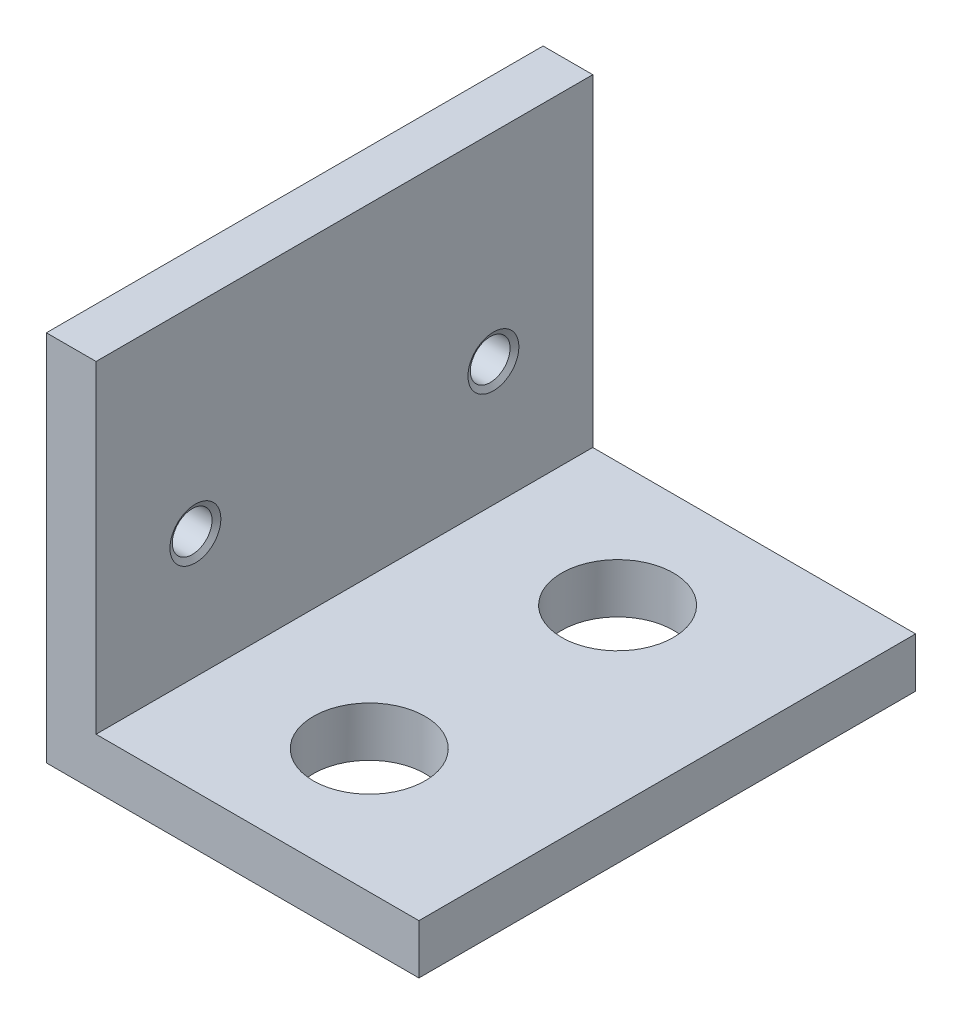
ISO-10303-21;
HEADER;
FILE_DESCRIPTION(('STEP AP214'),'2;1');
FILE_NAME('part.step','',(''),(''),'','','');
FILE_SCHEMA(('AUTOMOTIVE_DESIGN { 1 0 10303 214 1 1 1 1 }'));
ENDSEC;
DATA;
#1=APPLICATION_CONTEXT('core data for automotive mechanical design processes');
#2=APPLICATION_PROTOCOL_DEFINITION('international standard','automotive_design',2000,#1);
#3=PRODUCT_CONTEXT('',#1,'mechanical');
#4=PRODUCT('Part','Part','',(#3));
#5=PRODUCT_RELATED_PRODUCT_CATEGORY('part','',(#4));
#6=PRODUCT_DEFINITION_FORMATION('','',#4);
#7=PRODUCT_DEFINITION_CONTEXT('part definition',#1,'design');
#8=PRODUCT_DEFINITION('design','',#6,#7);
#9=PRODUCT_DEFINITION_SHAPE('','',#8);
#10=(LENGTH_UNIT() NAMED_UNIT(*) SI_UNIT(.MILLI.,.METRE.));
#11=(NAMED_UNIT(*) PLANE_ANGLE_UNIT() SI_UNIT($,.RADIAN.));
#12=(NAMED_UNIT(*) SI_UNIT($,.STERADIAN.) SOLID_ANGLE_UNIT());
#13=UNCERTAINTY_MEASURE_WITH_UNIT(LENGTH_MEASURE(1.E-05),#10,'distance_accuracy_value','');
#14=(GEOMETRIC_REPRESENTATION_CONTEXT(3) GLOBAL_UNCERTAINTY_ASSIGNED_CONTEXT((#13)) GLOBAL_UNIT_ASSIGNED_CONTEXT((#10,
#11,#12)) REPRESENTATION_CONTEXT('',''));
#15=CARTESIAN_POINT('',(0.,0.,0.));
#16=DIRECTION('',(0.,0.,1.));
#17=DIRECTION('',(1.,0.,0.));
#18=AXIS2_PLACEMENT_3D('',#15,#16,#17);
#19=CARTESIAN_POINT('',(15.,0.,20.));
#20=DIRECTION('',(0.,1.,0.));
#21=DIRECTION('',(-1.,0.,0.));
#22=AXIS2_PLACEMENT_3D('',#19,#20,#21);
#23=PLANE('',#22);
#24=CARTESIAN_POINT('',(8.,0.,5.));
#25=DIRECTION('',(0.,1.,0.));
#26=DIRECTION('',(-1.,0.,0.));
#27=AXIS2_PLACEMENT_3D('',#24,#25,#26);
#28=CIRCLE('',#27,2.24999999999999);
#29=CARTESIAN_POINT('',(5.75000000000001,0.,5.));
#30=VERTEX_POINT('',#29);
#31=EDGE_CURVE('E147',#30,#30,#28,.T.);
#32=ORIENTED_EDGE('',*,*,#31,.T.);
#33=EDGE_LOOP('',(#32));
#34=FACE_BOUND('',#33,.T.);
#35=CARTESIAN_POINT('',(8.,0.,15.));
#36=DIRECTION('',(0.,1.,0.));
#37=DIRECTION('',(-1.,0.,0.));
#38=AXIS2_PLACEMENT_3D('',#35,#36,#37);
#39=CIRCLE('',#38,2.24999999999999);
#40=CARTESIAN_POINT('',(5.75000000000001,0.,15.));
#41=VERTEX_POINT('',#40);
#42=EDGE_CURVE('E128',#41,#41,#39,.T.);
#43=ORIENTED_EDGE('',*,*,#42,.T.);
#44=EDGE_LOOP('',(#43));
#45=FACE_BOUND('',#44,.T.);
#46=DIRECTION('',(1.,0.,0.));
#47=VECTOR('',#46,1.);
#48=CARTESIAN_POINT('',(15.,0.,0.));
#49=LINE('',#48,#47);
#50=CARTESIAN_POINT('',(0.,0.,0.));
#51=VERTEX_POINT('',#50);
#52=CARTESIAN_POINT('',(15.,0.,0.));
#53=VERTEX_POINT('',#52);
#54=EDGE_CURVE('E124',#51,#53,#49,.T.);
#55=ORIENTED_EDGE('',*,*,#54,.T.);
#56=DIRECTION('',(0.,0.,-1.));
#57=VECTOR('',#56,1.);
#58=CARTESIAN_POINT('',(15.,0.,20.));
#59=LINE('',#58,#57);
#60=CARTESIAN_POINT('',(15.,0.,20.));
#61=VERTEX_POINT('',#60);
#62=EDGE_CURVE('E11',#61,#53,#59,.T.);
#63=ORIENTED_EDGE('',*,*,#62,.F.);
#64=DIRECTION('',(1.,0.,0.));
#65=VECTOR('',#64,1.);
#66=CARTESIAN_POINT('',(15.,0.,20.));
#67=LINE('',#66,#65);
#68=CARTESIAN_POINT('',(0.,0.,20.));
#69=VERTEX_POINT('',#68);
#70=EDGE_CURVE('E135',#69,#61,#67,.T.);
#71=ORIENTED_EDGE('',*,*,#70,.F.);
#72=DIRECTION('',(0.,0.,-1.));
#73=VECTOR('',#72,1.);
#74=CARTESIAN_POINT('',(0.,0.,20.));
#75=LINE('',#74,#73);
#76=EDGE_CURVE('E120',#69,#51,#75,.T.);
#77=ORIENTED_EDGE('',*,*,#76,.T.);
#78=EDGE_LOOP('',(#55,#63,#71,#77));
#79=FACE_BOUND('',#78,.T.);
#80=ADVANCED_FACE('F38',(#34,#45,#79),#23,.F.);
#81=CARTESIAN_POINT('',(15.,2.,20.));
#82=DIRECTION('',(-1.,0.,0.));
#83=DIRECTION('',(0.,0.,1.));
#84=AXIS2_PLACEMENT_3D('',#81,#82,#83);
#85=PLANE('',#84);
#86=DIRECTION('',(0.,1.,0.));
#87=VECTOR('',#86,1.);
#88=CARTESIAN_POINT('',(15.,2.,0.));
#89=LINE('',#88,#87);
#90=CARTESIAN_POINT('',(15.,2.,0.));
#91=VERTEX_POINT('',#90);
#92=EDGE_CURVE('E127',#53,#91,#89,.T.);
#93=ORIENTED_EDGE('',*,*,#92,.T.);
#94=DIRECTION('',(0.,0.,-1.));
#95=VECTOR('',#94,1.);
#96=CARTESIAN_POINT('',(15.,2.,20.));
#97=LINE('',#96,#95);
#98=CARTESIAN_POINT('',(15.,2.,20.));
#99=VERTEX_POINT('',#98);
#100=EDGE_CURVE('E47',#99,#91,#97,.T.);
#101=ORIENTED_EDGE('',*,*,#100,.F.);
#102=DIRECTION('',(0.,1.,0.));
#103=VECTOR('',#102,1.);
#104=CARTESIAN_POINT('',(15.,2.,20.));
#105=LINE('',#104,#103);
#106=EDGE_CURVE('E93',#61,#99,#105,.T.);
#107=ORIENTED_EDGE('',*,*,#106,.F.);
#108=ORIENTED_EDGE('',*,*,#62,.T.);
#109=EDGE_LOOP('',(#93,#101,#107,#108));
#110=FACE_BOUND('',#109,.T.);
#111=ADVANCED_FACE('F168',(#110),#85,.F.);
#112=CARTESIAN_POINT('',(2.,2.,20.));
#113=DIRECTION('',(0.,-1.,0.));
#114=DIRECTION('',(1.,0.,0.));
#115=AXIS2_PLACEMENT_3D('',#112,#113,#114);
#116=PLANE('',#115);
#117=CARTESIAN_POINT('',(8.,2.,5.));
#118=DIRECTION('',(0.,1.,0.));
#119=DIRECTION('',(0.,0.,1.));
#120=AXIS2_PLACEMENT_3D('',#117,#118,#119);
#121=CIRCLE('',#120,2.24999999999999);
#122=CARTESIAN_POINT('',(8.,2.,7.24999999999999));
#123=VERTEX_POINT('',#122);
#124=EDGE_CURVE('E142',#123,#123,#121,.T.);
#125=ORIENTED_EDGE('',*,*,#124,.F.);
#126=EDGE_LOOP('',(#125));
#127=FACE_BOUND('',#126,.T.);
#128=CARTESIAN_POINT('',(8.,2.,15.));
#129=DIRECTION('',(0.,1.,0.));
#130=DIRECTION('',(0.,0.,1.));
#131=AXIS2_PLACEMENT_3D('',#128,#129,#130);
#132=CIRCLE('',#131,2.24999999999999);
#133=CARTESIAN_POINT('',(8.,2.,17.25));
#134=VERTEX_POINT('',#133);
#135=EDGE_CURVE('E160',#134,#134,#132,.T.);
#136=ORIENTED_EDGE('',*,*,#135,.F.);
#137=EDGE_LOOP('',(#136));
#138=FACE_BOUND('',#137,.T.);
#139=DIRECTION('',(-1.,0.,0.));
#140=VECTOR('',#139,1.);
#141=CARTESIAN_POINT('',(2.,2.,0.));
#142=LINE('',#141,#140);
#143=CARTESIAN_POINT('',(2.,2.,0.));
#144=VERTEX_POINT('',#143);
#145=EDGE_CURVE('E130',#91,#144,#142,.T.);
#146=ORIENTED_EDGE('',*,*,#145,.T.);
#147=DIRECTION('',(0.,0.,-1.));
#148=VECTOR('',#147,1.);
#149=CARTESIAN_POINT('',(2.,2.,20.));
#150=LINE('',#149,#148);
#151=CARTESIAN_POINT('',(2.,2.,20.));
#152=VERTEX_POINT('',#151);
#153=EDGE_CURVE('E115',#152,#144,#150,.T.);
#154=ORIENTED_EDGE('',*,*,#153,.F.);
#155=DIRECTION('',(-1.,0.,0.));
#156=VECTOR('',#155,1.);
#157=CARTESIAN_POINT('',(2.,2.,20.));
#158=LINE('',#157,#156);
#159=EDGE_CURVE('E106',#99,#152,#158,.T.);
#160=ORIENTED_EDGE('',*,*,#159,.F.);
#161=ORIENTED_EDGE('',*,*,#100,.T.);
#162=EDGE_LOOP('',(#146,#154,#160,#161));
#163=FACE_BOUND('',#162,.T.);
#164=ADVANCED_FACE('F171',(#127,#138,#163),#116,.F.);
#165=CARTESIAN_POINT('',(2.,15.,20.));
#166=DIRECTION('',(-1.,0.,0.));
#167=DIRECTION('',(0.,-1.,0.));
#168=AXIS2_PLACEMENT_3D('',#165,#166,#167);
#169=PLANE('',#168);
#170=CARTESIAN_POINT('',(2.,7.,4.));
#171=DIRECTION('',(1.,0.,0.));
#172=DIRECTION('',(0.,0.,-1.));
#173=AXIS2_PLACEMENT_3D('',#170,#171,#172);
#174=CIRCLE('',#173,1.025);
#175=CARTESIAN_POINT('',(2.,7.,2.975));
#176=VERTEX_POINT('',#175);
#177=EDGE_CURVE('E231',#176,#176,#174,.T.);
#178=ORIENTED_EDGE('',*,*,#177,.F.);
#179=EDGE_LOOP('',(#178));
#180=FACE_BOUND('',#179,.T.);
#181=CARTESIAN_POINT('',(2.,7.,16.));
#182=DIRECTION('',(1.,0.,0.));
#183=DIRECTION('',(0.,0.,-1.));
#184=AXIS2_PLACEMENT_3D('',#181,#182,#183);
#185=CIRCLE('',#184,1.025);
#186=CARTESIAN_POINT('',(2.,7.,14.975));
#187=VERTEX_POINT('',#186);
#188=EDGE_CURVE('E150',#187,#187,#185,.T.);
#189=ORIENTED_EDGE('',*,*,#188,.F.);
#190=EDGE_LOOP('',(#189));
#191=FACE_BOUND('',#190,.T.);
#192=DIRECTION('',(0.,1.,0.));
#193=VECTOR('',#192,1.);
#194=CARTESIAN_POINT('',(2.,15.,0.));
#195=LINE('',#194,#193);
#196=CARTESIAN_POINT('',(2.,15.,0.));
#197=VERTEX_POINT('',#196);
#198=EDGE_CURVE('E114',#144,#197,#195,.T.);
#199=ORIENTED_EDGE('',*,*,#198,.T.);
#200=DIRECTION('',(0.,0.,-1.));
#201=VECTOR('',#200,1.);
#202=CARTESIAN_POINT('',(2.,15.,20.));
#203=LINE('',#202,#201);
#204=CARTESIAN_POINT('',(2.,15.,20.));
#205=VERTEX_POINT('',#204);
#206=EDGE_CURVE('E111',#205,#197,#203,.T.);
#207=ORIENTED_EDGE('',*,*,#206,.F.);
#208=DIRECTION('',(0.,1.,0.));
#209=VECTOR('',#208,1.);
#210=CARTESIAN_POINT('',(2.,15.,20.));
#211=LINE('',#210,#209);
#212=EDGE_CURVE('E100',#152,#205,#211,.T.);
#213=ORIENTED_EDGE('',*,*,#212,.F.);
#214=ORIENTED_EDGE('',*,*,#153,.T.);
#215=EDGE_LOOP('',(#199,#207,#213,#214));
#216=FACE_BOUND('',#215,.T.);
#217=ADVANCED_FACE('F112',(#180,#191,#216),#169,.F.);
#218=CARTESIAN_POINT('',(0.,15.,20.));
#219=DIRECTION('',(0.,-1.,0.));
#220=DIRECTION('',(0.,0.,-1.));
#221=AXIS2_PLACEMENT_3D('',#218,#219,#220);
#222=PLANE('',#221);
#223=DIRECTION('',(-1.,0.,0.));
#224=VECTOR('',#223,1.);
#225=CARTESIAN_POINT('',(0.,15.,0.));
#226=LINE('',#225,#224);
#227=CARTESIAN_POINT('',(0.,15.,0.));
#228=VERTEX_POINT('',#227);
#229=EDGE_CURVE('E79',#197,#228,#226,.T.);
#230=ORIENTED_EDGE('',*,*,#229,.T.);
#231=DIRECTION('',(0.,0.,-1.));
#232=VECTOR('',#231,1.);
#233=CARTESIAN_POINT('',(0.,15.,20.));
#234=LINE('',#233,#232);
#235=CARTESIAN_POINT('',(0.,15.,20.));
#236=VERTEX_POINT('',#235);
#237=EDGE_CURVE('E116',#236,#228,#234,.T.);
#238=ORIENTED_EDGE('',*,*,#237,.F.);
#239=DIRECTION('',(-1.,0.,0.));
#240=VECTOR('',#239,1.);
#241=CARTESIAN_POINT('',(0.,15.,20.));
#242=LINE('',#241,#240);
#243=EDGE_CURVE('E104',#205,#236,#242,.T.);
#244=ORIENTED_EDGE('',*,*,#243,.F.);
#245=ORIENTED_EDGE('',*,*,#206,.T.);
#246=EDGE_LOOP('',(#230,#238,#244,#245));
#247=FACE_BOUND('',#246,.T.);
#248=ADVANCED_FACE('F118',(#247),#222,.F.);
#249=CARTESIAN_POINT('',(0.,0.,20.));
#250=DIRECTION('',(1.,0.,0.));
#251=DIRECTION('',(0.,0.,-1.));
#252=AXIS2_PLACEMENT_3D('',#249,#250,#251);
#253=PLANE('',#252);
#254=CARTESIAN_POINT('',(0.,7.,4.));
#255=DIRECTION('',(1.,0.,0.));
#256=DIRECTION('',(0.,0.,-1.));
#257=AXIS2_PLACEMENT_3D('',#254,#255,#256);
#258=CIRCLE('',#257,0.799999999999999);
#259=CARTESIAN_POINT('',(0.,7.,3.2));
#260=VERTEX_POINT('',#259);
#261=EDGE_CURVE('E41',#260,#260,#258,.T.);
#262=ORIENTED_EDGE('',*,*,#261,.T.);
#263=EDGE_LOOP('',(#262));
#264=FACE_BOUND('',#263,.T.);
#265=CARTESIAN_POINT('',(0.,7.,16.));
#266=DIRECTION('',(1.,0.,0.));
#267=DIRECTION('',(0.,0.,-1.));
#268=AXIS2_PLACEMENT_3D('',#265,#266,#267);
#269=CIRCLE('',#268,0.799999999999999);
#270=CARTESIAN_POINT('',(0.,7.,15.2));
#271=VERTEX_POINT('',#270);
#272=EDGE_CURVE('E140',#271,#271,#269,.T.);
#273=ORIENTED_EDGE('',*,*,#272,.T.);
#274=EDGE_LOOP('',(#273));
#275=FACE_BOUND('',#274,.T.);
#276=DIRECTION('',(0.,-1.,0.));
#277=VECTOR('',#276,1.);
#278=CARTESIAN_POINT('',(0.,0.,0.));
#279=LINE('',#278,#277);
#280=EDGE_CURVE('E85',#228,#51,#279,.T.);
#281=ORIENTED_EDGE('',*,*,#280,.T.);
#282=ORIENTED_EDGE('',*,*,#76,.F.);
#283=DIRECTION('',(0.,-1.,0.));
#284=VECTOR('',#283,1.);
#285=CARTESIAN_POINT('',(0.,0.,20.));
#286=LINE('',#285,#284);
#287=EDGE_CURVE('E56',#236,#69,#286,.T.);
#288=ORIENTED_EDGE('',*,*,#287,.F.);
#289=ORIENTED_EDGE('',*,*,#237,.T.);
#290=EDGE_LOOP('',(#281,#282,#288,#289));
#291=FACE_BOUND('',#290,.T.);
#292=ADVANCED_FACE('F176',(#264,#275,#291),#253,.F.);
#293=CARTESIAN_POINT('',(0.,0.,20.));
#294=DIRECTION('',(0.,0.,-1.));
#295=DIRECTION('',(-1.,0.,0.));
#296=AXIS2_PLACEMENT_3D('',#293,#294,#295);
#297=PLANE('',#296);
#298=ORIENTED_EDGE('',*,*,#70,.T.);
#299=ORIENTED_EDGE('',*,*,#106,.T.);
#300=ORIENTED_EDGE('',*,*,#159,.T.);
#301=ORIENTED_EDGE('',*,*,#212,.T.);
#302=ORIENTED_EDGE('',*,*,#243,.T.);
#303=ORIENTED_EDGE('',*,*,#287,.T.);
#304=EDGE_LOOP('',(#298,#299,#300,#301,#302,#303));
#305=FACE_BOUND('',#304,.T.);
#306=ADVANCED_FACE('F102',(#305),#297,.F.);
#307=CARTESIAN_POINT('',(0.,0.,0.));
#308=DIRECTION('',(0.,0.,-1.));
#309=DIRECTION('',(-1.,0.,0.));
#310=AXIS2_PLACEMENT_3D('',#307,#308,#309);
#311=PLANE('',#310);
#312=ORIENTED_EDGE('',*,*,#54,.F.);
#313=ORIENTED_EDGE('',*,*,#280,.F.);
#314=ORIENTED_EDGE('',*,*,#229,.F.);
#315=ORIENTED_EDGE('',*,*,#198,.F.);
#316=ORIENTED_EDGE('',*,*,#145,.F.);
#317=ORIENTED_EDGE('',*,*,#92,.F.);
#318=EDGE_LOOP('',(#312,#313,#314,#315,#316,#317));
#319=FACE_BOUND('',#318,.T.);
#320=ADVANCED_FACE('F174',(#319),#311,.T.);
#321=CARTESIAN_POINT('',(8.,2.,15.));
#322=DIRECTION('',(0.,1.,0.));
#323=DIRECTION('',(0.,0.,1.));
#324=AXIS2_PLACEMENT_3D('',#321,#322,#323);
#325=CYLINDRICAL_SURFACE('',#324,2.24999999999999);
#326=ORIENTED_EDGE('',*,*,#135,.T.);
#327=EDGE_LOOP('',(#326));
#328=FACE_BOUND('',#327,.T.);
#329=ORIENTED_EDGE('',*,*,#42,.F.);
#330=EDGE_LOOP('',(#329));
#331=FACE_BOUND('',#330,.T.);
#332=ADVANCED_FACE('F197',(#328,#331),#325,.F.);
#333=CARTESIAN_POINT('',(8.,2.,5.));
#334=DIRECTION('',(0.,1.,0.));
#335=DIRECTION('',(0.,0.,1.));
#336=AXIS2_PLACEMENT_3D('',#333,#334,#335);
#337=CYLINDRICAL_SURFACE('',#336,2.24999999999999);
#338=ORIENTED_EDGE('',*,*,#124,.T.);
#339=EDGE_LOOP('',(#338));
#340=FACE_BOUND('',#339,.T.);
#341=ORIENTED_EDGE('',*,*,#31,.F.);
#342=EDGE_LOOP('',(#341));
#343=FACE_BOUND('',#342,.T.);
#344=ADVANCED_FACE('F199',(#340,#343),#337,.F.);
#345=CARTESIAN_POINT('',(2.,7.,16.));
#346=DIRECTION('',(1.,0.,0.));
#347=DIRECTION('',(0.,0.,-1.));
#348=AXIS2_PLACEMENT_3D('',#345,#346,#347);
#349=CYLINDRICAL_SURFACE('',#348,0.799999999999999);
#350=CARTESIAN_POINT('',(1.87009618943234,7.,16.));
#351=DIRECTION('',(1.,0.,0.));
#352=DIRECTION('',(0.,0.,-1.));
#353=AXIS2_PLACEMENT_3D('',#350,#351,#352);
#354=CIRCLE('',#353,0.799999999999999);
#355=CARTESIAN_POINT('',(1.87009618943234,7.,15.2));
#356=VERTEX_POINT('',#355);
#357=EDGE_CURVE('E143',#356,#356,#354,.T.);
#358=ORIENTED_EDGE('',*,*,#357,.T.);
#359=EDGE_LOOP('',(#358));
#360=FACE_BOUND('',#359,.T.);
#361=ORIENTED_EDGE('',*,*,#272,.F.);
#362=EDGE_LOOP('',(#361));
#363=FACE_BOUND('',#362,.T.);
#364=ADVANCED_FACE('F206',(#360,#363),#349,.F.);
#365=CARTESIAN_POINT('',(2.,7.,16.));
#366=DIRECTION('',(1.,0.,0.));
#367=DIRECTION('',(0.,0.,-1.));
#368=AXIS2_PLACEMENT_3D('',#365,#366,#367);
#369=CONICAL_SURFACE('',#368,1.025,1.0471975511966);
#370=ORIENTED_EDGE('',*,*,#357,.F.);
#371=EDGE_LOOP('',(#370));
#372=FACE_BOUND('',#371,.T.);
#373=ORIENTED_EDGE('',*,*,#188,.T.);
#374=EDGE_LOOP('',(#373));
#375=FACE_BOUND('',#374,.T.);
#376=ADVANCED_FACE('F212',(#372,#375),#369,.F.);
#377=CARTESIAN_POINT('',(2.,7.,4.));
#378=DIRECTION('',(1.,0.,0.));
#379=DIRECTION('',(0.,0.,-1.));
#380=AXIS2_PLACEMENT_3D('',#377,#378,#379);
#381=CYLINDRICAL_SURFACE('',#380,0.799999999999999);
#382=CARTESIAN_POINT('',(1.87009618943234,7.,4.));
#383=DIRECTION('',(1.,0.,0.));
#384=DIRECTION('',(0.,0.,-1.));
#385=AXIS2_PLACEMENT_3D('',#382,#383,#384);
#386=CIRCLE('',#385,0.799999999999999);
#387=CARTESIAN_POINT('',(1.87009618943234,7.,3.2));
#388=VERTEX_POINT('',#387);
#389=EDGE_CURVE('E228',#388,#388,#386,.T.);
#390=ORIENTED_EDGE('',*,*,#389,.T.);
#391=EDGE_LOOP('',(#390));
#392=FACE_BOUND('',#391,.T.);
#393=ORIENTED_EDGE('',*,*,#261,.F.);
#394=EDGE_LOOP('',(#393));
#395=FACE_BOUND('',#394,.T.);
#396=ADVANCED_FACE('F215',(#392,#395),#381,.F.);
#397=CARTESIAN_POINT('',(2.,7.,4.));
#398=DIRECTION('',(1.,0.,0.));
#399=DIRECTION('',(0.,0.,-1.));
#400=AXIS2_PLACEMENT_3D('',#397,#398,#399);
#401=CONICAL_SURFACE('',#400,1.025,1.0471975511966);
#402=ORIENTED_EDGE('',*,*,#389,.F.);
#403=EDGE_LOOP('',(#402));
#404=FACE_BOUND('',#403,.T.);
#405=ORIENTED_EDGE('',*,*,#177,.T.);
#406=EDGE_LOOP('',(#405));
#407=FACE_BOUND('',#406,.T.);
#408=ADVANCED_FACE('F219',(#404,#407),#401,.F.);
#409=CLOSED_SHELL('',(#80,#111,#164,#217,#248,#292,#306,#320,#332,#344,#364,#376,#396,#408));
#410=MANIFOLD_SOLID_BREP('B2',#409);
#411=ADVANCED_BREP_SHAPE_REPRESENTATION('',(#18,#410),#14);
#412=SHAPE_DEFINITION_REPRESENTATION(#9,#411);
ENDSEC;
END-ISO-10303-21;
